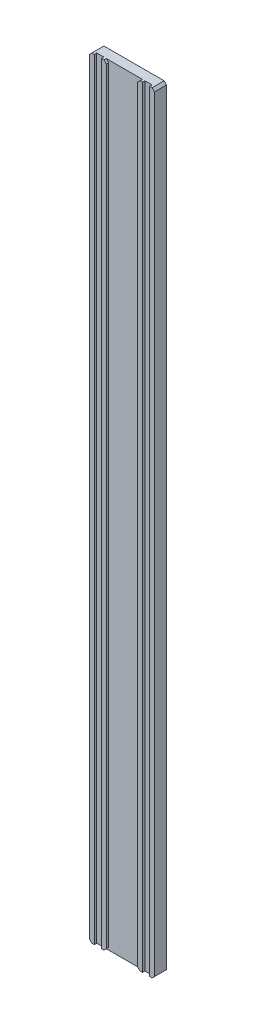
ISO-10303-21;
HEADER;
FILE_DESCRIPTION(('STEP AP214'),'2;1');
FILE_NAME('part.step','',(''),(''),'','','');
FILE_SCHEMA(('AUTOMOTIVE_DESIGN { 1 0 10303 214 1 1 1 1 }'));
ENDSEC;
DATA;
#1=APPLICATION_CONTEXT('core data for automotive mechanical design processes');
#2=APPLICATION_PROTOCOL_DEFINITION('international standard','automotive_design',2000,#1);
#3=PRODUCT_CONTEXT('',#1,'mechanical');
#4=PRODUCT('Part','Part','',(#3));
#5=PRODUCT_RELATED_PRODUCT_CATEGORY('part','',(#4));
#6=PRODUCT_DEFINITION_FORMATION('','',#4);
#7=PRODUCT_DEFINITION_CONTEXT('part definition',#1,'design');
#8=PRODUCT_DEFINITION('design','',#6,#7);
#9=PRODUCT_DEFINITION_SHAPE('','',#8);
#10=(LENGTH_UNIT() NAMED_UNIT(*) SI_UNIT(.MILLI.,.METRE.));
#11=(NAMED_UNIT(*) PLANE_ANGLE_UNIT() SI_UNIT($,.RADIAN.));
#12=(NAMED_UNIT(*) SI_UNIT($,.STERADIAN.) SOLID_ANGLE_UNIT());
#13=UNCERTAINTY_MEASURE_WITH_UNIT(LENGTH_MEASURE(1.E-05),#10,'distance_accuracy_value','');
#14=(GEOMETRIC_REPRESENTATION_CONTEXT(3) GLOBAL_UNCERTAINTY_ASSIGNED_CONTEXT((#13)) GLOBAL_UNIT_ASSIGNED_CONTEXT((#10,
#11,#12)) REPRESENTATION_CONTEXT('',''));
#15=CARTESIAN_POINT('',(0.,0.,0.));
#16=DIRECTION('',(0.,0.,1.));
#17=DIRECTION('',(1.,0.,0.));
#18=AXIS2_PLACEMENT_3D('',#15,#16,#17);
#19=CARTESIAN_POINT('',(-6.49999999999993,-119.,0.));
#20=DIRECTION('',(0.707106781186547,-0.707106781186547,0.));
#21=DIRECTION('',(0.,0.,1.));
#22=AXIS2_PLACEMENT_3D('',#19,#20,#21);
#23=PLANE('',#22);
#24=DIRECTION('',(0.,0.,1.));
#25=VECTOR('',#24,1.);
#26=CARTESIAN_POINT('',(-7.49999999999984,-120.,2.99999999999996));
#27=LINE('',#26,#25);
#28=CARTESIAN_POINT('',(-7.49999999999984,-120.,2.));
#29=VERTEX_POINT('',#28);
#30=CARTESIAN_POINT('',(-7.49999999999984,-120.,2.99999999999996));
#31=VERTEX_POINT('',#30);
#32=EDGE_CURVE('E363',#29,#31,#27,.T.);
#33=ORIENTED_EDGE('',*,*,#32,.F.);
#34=DIRECTION('',(0.707106781186529,0.707106781186567,0.));
#35=VECTOR('',#34,1.);
#36=CARTESIAN_POINT('',(-7.49999999999984,-120.,2.));
#37=LINE('',#36,#35);
#38=CARTESIAN_POINT('',(-6.49999999999993,-119.,2.));
#39=VERTEX_POINT('',#38);
#40=EDGE_CURVE('E242',#29,#39,#37,.T.);
#41=ORIENTED_EDGE('',*,*,#40,.T.);
#42=DIRECTION('',(0.,0.,-1.));
#43=VECTOR('',#42,1.);
#44=CARTESIAN_POINT('',(-6.49999999999993,-119.,0.));
#45=LINE('',#44,#43);
#46=CARTESIAN_POINT('',(-6.49999999999993,-119.,2.99999999999996));
#47=VERTEX_POINT('',#46);
#48=EDGE_CURVE('E358',#47,#39,#45,.T.);
#49=ORIENTED_EDGE('',*,*,#48,.F.);
#50=DIRECTION('',(0.707106781186548,0.707106781186548,0.));
#51=VECTOR('',#50,1.);
#52=CARTESIAN_POINT('',(149.5,36.9999999999998,2.99999999999998));
#53=LINE('',#52,#51);
#54=EDGE_CURVE('E372',#31,#47,#53,.T.);
#55=ORIENTED_EDGE('',*,*,#54,.F.);
#56=EDGE_LOOP('',(#33,#41,#49,#55));
#57=FACE_BOUND('',#56,.T.);
#58=ADVANCED_FACE('F36',(#57),#23,.T.);
#59=CARTESIAN_POINT('',(7.50000000000017,-120.,2.99999999999996));
#60=DIRECTION('',(0.707106781186538,0.707106781186557,0.));
#61=DIRECTION('',(0.,0.,-1.));
#62=AXIS2_PLACEMENT_3D('',#59,#60,#61);
#63=PLANE('',#62);
#64=DIRECTION('',(0.,0.,1.));
#65=VECTOR('',#64,1.);
#66=CARTESIAN_POINT('',(6.50000000000012,-119.,0.));
#67=LINE('',#66,#65);
#68=CARTESIAN_POINT('',(6.50000000000012,-119.,2.));
#69=VERTEX_POINT('',#68);
#70=CARTESIAN_POINT('',(6.50000000000012,-119.,2.99999999999996));
#71=VERTEX_POINT('',#70);
#72=EDGE_CURVE('E341',#69,#71,#67,.T.);
#73=ORIENTED_EDGE('',*,*,#72,.F.);
#74=DIRECTION('',(0.707106781186559,-0.707106781186536,0.));
#75=VECTOR('',#74,1.);
#76=CARTESIAN_POINT('',(6.50000000000012,-119.,2.));
#77=LINE('',#76,#75);
#78=CARTESIAN_POINT('',(7.50000000000018,-120.,2.));
#79=VERTEX_POINT('',#78);
#80=EDGE_CURVE('E244',#69,#79,#77,.T.);
#81=ORIENTED_EDGE('',*,*,#80,.T.);
#82=DIRECTION('',(0.,0.,-1.));
#83=VECTOR('',#82,1.);
#84=CARTESIAN_POINT('',(7.50000000000018,-120.,2.99999999999996));
#85=LINE('',#84,#83);
#86=CARTESIAN_POINT('',(7.50000000000018,-120.,2.99999999999996));
#87=VERTEX_POINT('',#86);
#88=EDGE_CURVE('E336',#87,#79,#85,.T.);
#89=ORIENTED_EDGE('',*,*,#88,.F.);
#90=DIRECTION('',(-0.707106781186557,0.707106781186538,0.));
#91=VECTOR('',#90,1.);
#92=CARTESIAN_POINT('',(7.50000000000017,-120.,2.99999999999996));
#93=LINE('',#92,#91);
#94=EDGE_CURVE('E349',#71,#87,#93,.F.);
#95=ORIENTED_EDGE('',*,*,#94,.F.);
#96=EDGE_LOOP('',(#73,#81,#89,#95));
#97=FACE_BOUND('',#96,.T.);
#98=ADVANCED_FACE('F433',(#97),#63,.F.);
#99=CARTESIAN_POINT('',(-6.50000000000018,199.,0.));
#100=DIRECTION('',(0.707106781186547,0.707106781186547,0.));
#101=DIRECTION('',(0.,0.,-1.));
#102=AXIS2_PLACEMENT_3D('',#99,#100,#101);
#103=PLANE('',#102);
#104=DIRECTION('',(0.,0.,1.));
#105=VECTOR('',#104,1.);
#106=CARTESIAN_POINT('',(-6.50000000000018,199.,3.));
#107=LINE('',#106,#105);
#108=CARTESIAN_POINT('',(-6.50000000000007,199.,2.));
#109=VERTEX_POINT('',#108);
#110=CARTESIAN_POINT('',(-6.50000000000018,199.,3.));
#111=VERTEX_POINT('',#110);
#112=EDGE_CURVE('E356',#109,#111,#107,.T.);
#113=ORIENTED_EDGE('',*,*,#112,.F.);
#114=DIRECTION('',(-0.707106781186549,0.707106781186546,0.));
#115=VECTOR('',#114,1.);
#116=CARTESIAN_POINT('',(-6.50000000000018,199.,2.));
#117=LINE('',#116,#115);
#118=CARTESIAN_POINT('',(-7.50000000000013,200.,2.));
#119=VERTEX_POINT('',#118);
#120=EDGE_CURVE('E247',#109,#119,#117,.T.);
#121=ORIENTED_EDGE('',*,*,#120,.T.);
#122=DIRECTION('',(0.,0.,-1.));
#123=VECTOR('',#122,1.);
#124=CARTESIAN_POINT('',(-7.50000000000013,200.,0.));
#125=LINE('',#124,#123);
#126=CARTESIAN_POINT('',(-7.50000000000013,200.,3.));
#127=VERTEX_POINT('',#126);
#128=EDGE_CURVE('E11',#127,#119,#125,.T.);
#129=ORIENTED_EDGE('',*,*,#128,.F.);
#130=DIRECTION('',(-0.707106781186548,0.707106781186548,0.));
#131=VECTOR('',#130,1.);
#132=CARTESIAN_POINT('',(-10.5000000000002,203.,3.));
#133=LINE('',#132,#131);
#134=EDGE_CURVE('E367',#111,#127,#133,.T.);
#135=ORIENTED_EDGE('',*,*,#134,.F.);
#136=EDGE_LOOP('',(#113,#121,#129,#135));
#137=FACE_BOUND('',#136,.T.);
#138=ADVANCED_FACE('F412',(#137),#103,.T.);
#139=CARTESIAN_POINT('',(-13.5000000000002,200.,3.));
#140=DIRECTION('',(0.,0.,1.));
#141=DIRECTION('',(0.,-1.,0.));
#142=AXIS2_PLACEMENT_3D('',#139,#140,#141);
#143=PLANE('',#142);
#144=DIRECTION('',(1.,0.,0.));
#145=VECTOR('',#144,1.);
#146=CARTESIAN_POINT('',(-13.5000000000002,200.,3.));
#147=LINE('',#146,#145);
#148=CARTESIAN_POINT('',(-8.50000000000018,200.,2.99999999999961));
#149=VERTEX_POINT('',#148);
#150=EDGE_CURVE('E282',#149,#127,#147,.T.);
#151=ORIENTED_EDGE('',*,*,#150,.F.);
#152=DIRECTION('',(0.,-1.,0.));
#153=VECTOR('',#152,1.);
#154=CARTESIAN_POINT('',(-8.50000000000018,200.,2.99999999999961));
#155=LINE('',#154,#153);
#156=CARTESIAN_POINT('',(-8.49999999999993,-120.,2.99999999999998));
#157=VERTEX_POINT('',#156);
#158=EDGE_CURVE('E270',#149,#157,#155,.T.);
#159=ORIENTED_EDGE('',*,*,#158,.T.);
#160=DIRECTION('',(1.,0.,0.));
#161=VECTOR('',#160,1.);
#162=CARTESIAN_POINT('',(-13.4999999999999,-120.,2.99999999999996));
#163=LINE('',#162,#161);
#164=EDGE_CURVE('E288',#157,#31,#163,.T.);
#165=ORIENTED_EDGE('',*,*,#164,.T.);
#166=ORIENTED_EDGE('',*,*,#54,.T.);
#167=DIRECTION('',(0.,-1.,0.));
#168=VECTOR('',#167,1.);
#169=CARTESIAN_POINT('',(-6.50000000000018,200.,3.));
#170=LINE('',#169,#168);
#171=EDGE_CURVE('E273',#111,#47,#170,.T.);
#172=ORIENTED_EDGE('',*,*,#171,.F.);
#173=ORIENTED_EDGE('',*,*,#134,.T.);
#174=EDGE_LOOP('',(#151,#159,#165,#166,#172,#173));
#175=FACE_BOUND('',#174,.T.);
#176=ADVANCED_FACE('F405',(#175),#143,.T.);
#177=CARTESIAN_POINT('',(-12.5,-120.,2.99999999999996));
#178=VERTEX_POINT('',#177);
#179=CARTESIAN_POINT('',(-11.4999999999999,-120.,2.99999999999998));
#180=VERTEX_POINT('',#179);
#181=EDGE_CURVE('E289',#178,#180,#163,.T.);
#182=ORIENTED_EDGE('',*,*,#181,.T.);
#183=DIRECTION('',(0.,-1.,0.));
#184=VECTOR('',#183,1.);
#185=CARTESIAN_POINT('',(-11.5000000000002,200.,2.99999999999961));
#186=LINE('',#185,#184);
#187=CARTESIAN_POINT('',(-11.5000000000002,200.,2.99999999999961));
#188=VERTEX_POINT('',#187);
#189=EDGE_CURVE('E262',#188,#180,#186,.T.);
#190=ORIENTED_EDGE('',*,*,#189,.F.);
#191=CARTESIAN_POINT('',(-12.5000000000002,200.,3.));
#192=VERTEX_POINT('',#191);
#193=EDGE_CURVE('E285',#192,#188,#147,.T.);
#194=ORIENTED_EDGE('',*,*,#193,.F.);
#195=DIRECTION('',(0.707106781186557,0.707106781186538,0.));
#196=VECTOR('',#195,1.);
#197=CARTESIAN_POINT('',(-13.0000000000002,199.5,3.));
#198=LINE('',#197,#196);
#199=CARTESIAN_POINT('',(-13.5000000000002,199.,3.));
#200=VERTEX_POINT('',#199);
#201=EDGE_CURVE('E365',#192,#200,#198,.F.);
#202=ORIENTED_EDGE('',*,*,#201,.T.);
#203=DIRECTION('',(0.,-1.,0.));
#204=VECTOR('',#203,1.);
#205=CARTESIAN_POINT('',(-13.5000000000002,200.,3.));
#206=LINE('',#205,#204);
#207=CARTESIAN_POINT('',(-13.4999999999999,-119.,2.99999999999996));
#208=VERTEX_POINT('',#207);
#209=EDGE_CURVE('E279',#200,#208,#206,.T.);
#210=ORIENTED_EDGE('',*,*,#209,.T.);
#211=DIRECTION('',(-0.707106781186548,0.707106781186548,0.));
#212=VECTOR('',#211,1.);
#213=CARTESIAN_POINT('',(-173.,40.5000000000001,2.99999999999998));
#214=LINE('',#213,#212);
#215=EDGE_CURVE('E370',#208,#178,#214,.F.);
#216=ORIENTED_EDGE('',*,*,#215,.T.);
#217=EDGE_LOOP('',(#182,#190,#194,#202,#210,#216));
#218=FACE_BOUND('',#217,.T.);
#219=ADVANCED_FACE('F387',(#218),#143,.T.);
#220=CARTESIAN_POINT('',(13.4999999999999,200.,3.));
#221=DIRECTION('',(0.,0.,-1.));
#222=DIRECTION('',(0.,1.,0.));
#223=AXIS2_PLACEMENT_3D('',#220,#221,#222);
#224=PLANE('',#223);
#225=DIRECTION('',(-1.,0.,0.));
#226=VECTOR('',#225,1.);
#227=CARTESIAN_POINT('',(13.4999999999999,200.,3.));
#228=LINE('',#227,#226);
#229=CARTESIAN_POINT('',(12.4999999999999,200.,3.));
#230=VERTEX_POINT('',#229);
#231=CARTESIAN_POINT('',(11.4999999999999,200.,2.99999999999961));
#232=VERTEX_POINT('',#231);
#233=EDGE_CURVE('E329',#230,#232,#228,.T.);
#234=ORIENTED_EDGE('',*,*,#233,.T.);
#235=DIRECTION('',(0.,-1.,0.));
#236=VECTOR('',#235,1.);
#237=CARTESIAN_POINT('',(11.4999999999999,200.,2.99999999999961));
#238=LINE('',#237,#236);
#239=CARTESIAN_POINT('',(11.5000000000001,-120.,2.99999999999998));
#240=VERTEX_POINT('',#239);
#241=EDGE_CURVE('E312',#232,#240,#238,.T.);
#242=ORIENTED_EDGE('',*,*,#241,.T.);
#243=DIRECTION('',(-1.,0.,0.));
#244=VECTOR('',#243,1.);
#245=CARTESIAN_POINT('',(13.5000000000001,-120.,2.99999999999996));
#246=LINE('',#245,#244);
#247=CARTESIAN_POINT('',(12.5000000000001,-120.,2.99999999999996));
#248=VERTEX_POINT('',#247);
#249=EDGE_CURVE('E325',#248,#240,#246,.T.);
#250=ORIENTED_EDGE('',*,*,#249,.F.);
#251=DIRECTION('',(0.707106781186548,0.707106781186548,0.));
#252=VECTOR('',#251,1.);
#253=CARTESIAN_POINT('',(13.5000000000001,-119.,2.99999999999996));
#254=LINE('',#253,#252);
#255=CARTESIAN_POINT('',(13.5000000000001,-119.,2.99999999999996));
#256=VERTEX_POINT('',#255);
#257=EDGE_CURVE('E347',#248,#256,#254,.T.);
#258=ORIENTED_EDGE('',*,*,#257,.T.);
#259=DIRECTION('',(0.,-1.,0.));
#260=VECTOR('',#259,1.);
#261=CARTESIAN_POINT('',(13.4999999999999,200.,3.));
#262=LINE('',#261,#260);
#263=CARTESIAN_POINT('',(13.4999999999999,199.,3.));
#264=VERTEX_POINT('',#263);
#265=EDGE_CURVE('E207',#264,#256,#262,.T.);
#266=ORIENTED_EDGE('',*,*,#265,.F.);
#267=DIRECTION('',(-0.707106781186548,0.707106781186548,0.));
#268=VECTOR('',#267,1.);
#269=CARTESIAN_POINT('',(13.4999999999999,199.,3.));
#270=LINE('',#269,#268);
#271=EDGE_CURVE('E343',#264,#230,#270,.T.);
#272=ORIENTED_EDGE('',*,*,#271,.T.);
#273=EDGE_LOOP('',(#234,#242,#250,#258,#266,#272));
#274=FACE_BOUND('',#273,.T.);
#275=ADVANCED_FACE('F449',(#274),#224,.F.);
#276=CARTESIAN_POINT('',(0.,0.,2.));
#277=DIRECTION('',(0.,0.,-1.));
#278=DIRECTION('',(-1.,0.,0.));
#279=AXIS2_PLACEMENT_3D('',#276,#277,#278);
#280=PLANE('',#279);
#281=DIRECTION('',(0.,1.,0.));
#282=VECTOR('',#281,1.);
#283=CARTESIAN_POINT('',(-6.50000000000011,80.,2.));
#284=LINE('',#283,#282);
#285=EDGE_CURVE('E292',#39,#109,#284,.T.);
#286=ORIENTED_EDGE('',*,*,#285,.F.);
#287=ORIENTED_EDGE('',*,*,#40,.F.);
#288=DIRECTION('',(-1.,0.,0.));
#289=VECTOR('',#288,1.);
#290=CARTESIAN_POINT('',(-6.5,-120.,2.));
#291=LINE('',#290,#289);
#292=EDGE_CURVE('E52',#79,#29,#291,.T.);
#293=ORIENTED_EDGE('',*,*,#292,.F.);
#294=ORIENTED_EDGE('',*,*,#80,.F.);
#295=DIRECTION('',(0.,1.,0.));
#296=VECTOR('',#295,1.);
#297=CARTESIAN_POINT('',(6.49999999999998,80.,2.));
#298=LINE('',#297,#296);
#299=CARTESIAN_POINT('',(6.49999999999987,199.,2.));
#300=VERTEX_POINT('',#299);
#301=EDGE_CURVE('E332',#69,#300,#298,.T.);
#302=ORIENTED_EDGE('',*,*,#301,.T.);
#303=DIRECTION('',(-0.707106781186546,-0.707106781186549,0.));
#304=VECTOR('',#303,1.);
#305=CARTESIAN_POINT('',(6.49999999999987,199.,2.));
#306=LINE('',#305,#304);
#307=CARTESIAN_POINT('',(7.49999999999986,200.,2.));
#308=VERTEX_POINT('',#307);
#309=EDGE_CURVE('E249',#308,#300,#306,.T.);
#310=ORIENTED_EDGE('',*,*,#309,.F.);
#311=DIRECTION('',(-1.,0.,0.));
#312=VECTOR('',#311,1.);
#313=CARTESIAN_POINT('',(-6.50000000000007,200.,2.));
#314=LINE('',#313,#312);
#315=EDGE_CURVE('E60',#308,#119,#314,.T.);
#316=ORIENTED_EDGE('',*,*,#315,.T.);
#317=ORIENTED_EDGE('',*,*,#120,.F.);
#318=EDGE_LOOP('',(#286,#287,#293,#294,#302,#310,#316,#317));
#319=FACE_BOUND('',#318,.T.);
#320=ADVANCED_FACE('F417',(#319),#280,.F.);
#321=CARTESIAN_POINT('',(13.4999999999999,200.,0.));
#322=DIRECTION('',(0.,-1.,0.));
#323=DIRECTION('',(1.,0.,0.));
#324=AXIS2_PLACEMENT_3D('',#321,#322,#323);
#325=PLANE('',#324);
#326=DIRECTION('',(1.,0.,0.));
#327=VECTOR('',#326,1.);
#328=CARTESIAN_POINT('',(8.49999999999987,200.,1.99999999999961));
#329=LINE('',#328,#327);
#330=CARTESIAN_POINT('',(8.49999999999987,200.,1.99999999999961));
#331=VERTEX_POINT('',#330);
#332=CARTESIAN_POINT('',(11.4999999999999,200.,1.99999999999961));
#333=VERTEX_POINT('',#332);
#334=EDGE_CURVE('E298',#331,#333,#329,.T.);
#335=ORIENTED_EDGE('',*,*,#334,.T.);
#336=DIRECTION('',(0.,0.,1.));
#337=VECTOR('',#336,1.);
#338=CARTESIAN_POINT('',(11.4999999999999,200.,1.99999999999961));
#339=LINE('',#338,#337);
#340=EDGE_CURVE('E302',#333,#232,#339,.T.);
#341=ORIENTED_EDGE('',*,*,#340,.T.);
#342=ORIENTED_EDGE('',*,*,#233,.F.);
#343=DIRECTION('',(0.,0.,-1.));
#344=VECTOR('',#343,1.);
#345=CARTESIAN_POINT('',(12.4999999999999,200.,0.));
#346=LINE('',#345,#344);
#347=CARTESIAN_POINT('',(12.4999999999999,200.,-2.));
#348=VERTEX_POINT('',#347);
#349=EDGE_CURVE('E210',#230,#348,#346,.T.);
#350=ORIENTED_EDGE('',*,*,#349,.T.);
#351=DIRECTION('',(1.,0.,0.));
#352=VECTOR('',#351,1.);
#353=CARTESIAN_POINT('',(-12.5000000000002,200.,-2.));
#354=LINE('',#353,#352);
#355=CARTESIAN_POINT('',(-12.5000000000002,200.,-2.));
#356=VERTEX_POINT('',#355);
#357=EDGE_CURVE('E239',#356,#348,#354,.T.);
#358=ORIENTED_EDGE('',*,*,#357,.F.);
#359=DIRECTION('',(0.,0.,1.));
#360=VECTOR('',#359,1.);
#361=CARTESIAN_POINT('',(-12.5000000000002,200.,0.));
#362=LINE('',#361,#360);
#363=EDGE_CURVE('E45',#356,#192,#362,.T.);
#364=ORIENTED_EDGE('',*,*,#363,.T.);
#365=ORIENTED_EDGE('',*,*,#193,.T.);
#366=DIRECTION('',(0.,0.,1.));
#367=VECTOR('',#366,1.);
#368=CARTESIAN_POINT('',(-11.5000000000002,200.,1.99999999999961));
#369=LINE('',#368,#367);
#370=CARTESIAN_POINT('',(-11.5000000000002,200.,1.99999999999961));
#371=VERTEX_POINT('',#370);
#372=EDGE_CURVE('E254',#371,#188,#369,.T.);
#373=ORIENTED_EDGE('',*,*,#372,.F.);
#374=DIRECTION('',(-1.,0.,0.));
#375=VECTOR('',#374,1.);
#376=CARTESIAN_POINT('',(-8.50000000000018,200.,1.99999999999961));
#377=LINE('',#376,#375);
#378=CARTESIAN_POINT('',(-8.50000000000018,200.,1.99999999999961));
#379=VERTEX_POINT('',#378);
#380=EDGE_CURVE('E256',#379,#371,#377,.T.);
#381=ORIENTED_EDGE('',*,*,#380,.F.);
#382=DIRECTION('',(0.,0.,-1.));
#383=VECTOR('',#382,1.);
#384=CARTESIAN_POINT('',(-8.50000000000018,200.,2.99999999999961));
#385=LINE('',#384,#383);
#386=EDGE_CURVE('E260',#149,#379,#385,.T.);
#387=ORIENTED_EDGE('',*,*,#386,.F.);
#388=ORIENTED_EDGE('',*,*,#150,.T.);
#389=ORIENTED_EDGE('',*,*,#128,.T.);
#390=ORIENTED_EDGE('',*,*,#315,.F.);
#391=DIRECTION('',(0.,0.,1.));
#392=VECTOR('',#391,1.);
#393=CARTESIAN_POINT('',(7.49999999999986,200.,0.));
#394=LINE('',#393,#392);
#395=CARTESIAN_POINT('',(7.49999999999986,200.,3.));
#396=VERTEX_POINT('',#395);
#397=EDGE_CURVE('E354',#308,#396,#394,.T.);
#398=ORIENTED_EDGE('',*,*,#397,.T.);
#399=CARTESIAN_POINT('',(8.49999999999987,200.,2.99999999999961));
#400=VERTEX_POINT('',#399);
#401=EDGE_CURVE('E328',#400,#396,#228,.T.);
#402=ORIENTED_EDGE('',*,*,#401,.F.);
#403=DIRECTION('',(0.,0.,-1.));
#404=VECTOR('',#403,1.);
#405=CARTESIAN_POINT('',(8.49999999999987,200.,2.99999999999961));
#406=LINE('',#405,#404);
#407=EDGE_CURVE('E295',#400,#331,#406,.T.);
#408=ORIENTED_EDGE('',*,*,#407,.T.);
#409=EDGE_LOOP('',(#335,#341,#342,#350,#358,#364,#365,#373,#381,#387,#388,#389,#390,#398,#402,#408));
#410=FACE_BOUND('',#409,.T.);
#411=ADVANCED_FACE('F381',(#410),#325,.F.);
#412=CARTESIAN_POINT('',(8.50000000000012,-120.,2.99999999999996));
#413=VERTEX_POINT('',#412);
#414=EDGE_CURVE('E322',#413,#87,#246,.T.);
#415=ORIENTED_EDGE('',*,*,#414,.F.);
#416=DIRECTION('',(0.,-1.,0.));
#417=VECTOR('',#416,1.);
#418=CARTESIAN_POINT('',(8.49999999999987,200.,2.99999999999961));
#419=LINE('',#418,#417);
#420=EDGE_CURVE('E305',#400,#413,#419,.T.);
#421=ORIENTED_EDGE('',*,*,#420,.F.);
#422=ORIENTED_EDGE('',*,*,#401,.T.);
#423=DIRECTION('',(0.707106781186548,0.707106781186548,0.));
#424=VECTOR('',#423,1.);
#425=CARTESIAN_POINT('',(7.49999999999987,200.,3.));
#426=LINE('',#425,#424);
#427=CARTESIAN_POINT('',(6.49999999999987,199.,3.));
#428=VERTEX_POINT('',#427);
#429=EDGE_CURVE('E345',#396,#428,#426,.F.);
#430=ORIENTED_EDGE('',*,*,#429,.T.);
#431=DIRECTION('',(0.,-1.,0.));
#432=VECTOR('',#431,1.);
#433=CARTESIAN_POINT('',(6.49999999999987,200.,3.));
#434=LINE('',#433,#432);
#435=EDGE_CURVE('E315',#428,#71,#434,.T.);
#436=ORIENTED_EDGE('',*,*,#435,.T.);
#437=ORIENTED_EDGE('',*,*,#94,.T.);
#438=EDGE_LOOP('',(#415,#421,#422,#430,#436,#437));
#439=FACE_BOUND('',#438,.T.);
#440=ADVANCED_FACE('F426',(#439),#224,.F.);
#441=CARTESIAN_POINT('',(13.5000000000001,-120.,2.99999999999996));
#442=DIRECTION('',(0.,1.,0.));
#443=DIRECTION('',(-1.,0.,0.));
#444=AXIS2_PLACEMENT_3D('',#441,#442,#443);
#445=PLANE('',#444);
#446=ORIENTED_EDGE('',*,*,#249,.T.);
#447=DIRECTION('',(0.,0.,1.));
#448=VECTOR('',#447,1.);
#449=CARTESIAN_POINT('',(11.5000000000001,-120.,1.99999999999998));
#450=LINE('',#449,#448);
#451=CARTESIAN_POINT('',(11.5000000000001,-120.,1.99999999999998));
#452=VERTEX_POINT('',#451);
#453=EDGE_CURVE('E299',#452,#240,#450,.T.);
#454=ORIENTED_EDGE('',*,*,#453,.F.);
#455=DIRECTION('',(1.,0.,0.));
#456=VECTOR('',#455,1.);
#457=CARTESIAN_POINT('',(8.50000000000012,-120.,1.99999999999998));
#458=LINE('',#457,#456);
#459=CARTESIAN_POINT('',(8.50000000000012,-120.,1.99999999999998));
#460=VERTEX_POINT('',#459);
#461=EDGE_CURVE('E308',#460,#452,#458,.T.);
#462=ORIENTED_EDGE('',*,*,#461,.F.);
#463=DIRECTION('',(0.,0.,-1.));
#464=VECTOR('',#463,1.);
#465=CARTESIAN_POINT('',(8.50000000000012,-120.,2.99999999999998));
#466=LINE('',#465,#464);
#467=EDGE_CURVE('E294',#413,#460,#466,.T.);
#468=ORIENTED_EDGE('',*,*,#467,.F.);
#469=ORIENTED_EDGE('',*,*,#414,.T.);
#470=ORIENTED_EDGE('',*,*,#88,.T.);
#471=ORIENTED_EDGE('',*,*,#292,.T.);
#472=ORIENTED_EDGE('',*,*,#32,.T.);
#473=ORIENTED_EDGE('',*,*,#164,.F.);
#474=DIRECTION('',(0.,0.,-1.));
#475=VECTOR('',#474,1.);
#476=CARTESIAN_POINT('',(-8.49999999999993,-120.,2.99999999999998));
#477=LINE('',#476,#475);
#478=CARTESIAN_POINT('',(-8.49999999999993,-120.,1.99999999999998));
#479=VERTEX_POINT('',#478);
#480=EDGE_CURVE('E257',#157,#479,#477,.T.);
#481=ORIENTED_EDGE('',*,*,#480,.T.);
#482=DIRECTION('',(-1.,0.,0.));
#483=VECTOR('',#482,1.);
#484=CARTESIAN_POINT('',(-8.49999999999993,-120.,1.99999999999998));
#485=LINE('',#484,#483);
#486=CARTESIAN_POINT('',(-11.4999999999999,-120.,1.99999999999998));
#487=VERTEX_POINT('',#486);
#488=EDGE_CURVE('E265',#479,#487,#485,.T.);
#489=ORIENTED_EDGE('',*,*,#488,.T.);
#490=DIRECTION('',(0.,0.,1.));
#491=VECTOR('',#490,1.);
#492=CARTESIAN_POINT('',(-11.4999999999999,-120.,1.99999999999998));
#493=LINE('',#492,#491);
#494=EDGE_CURVE('E253',#487,#180,#493,.T.);
#495=ORIENTED_EDGE('',*,*,#494,.T.);
#496=ORIENTED_EDGE('',*,*,#181,.F.);
#497=DIRECTION('',(0.,0.,-1.));
#498=VECTOR('',#497,1.);
#499=CARTESIAN_POINT('',(-12.5,-120.,2.99999999999996));
#500=LINE('',#499,#498);
#501=CARTESIAN_POINT('',(-12.5,-120.,-2.));
#502=VERTEX_POINT('',#501);
#503=EDGE_CURVE('E361',#178,#502,#500,.T.);
#504=ORIENTED_EDGE('',*,*,#503,.T.);
#505=DIRECTION('',(-1.,0.,0.));
#506=VECTOR('',#505,1.);
#507=CARTESIAN_POINT('',(12.5000000000001,-120.,-2.));
#508=LINE('',#507,#506);
#509=CARTESIAN_POINT('',(12.5000000000001,-120.,-2.));
#510=VERTEX_POINT('',#509);
#511=EDGE_CURVE('E220',#510,#502,#508,.T.);
#512=ORIENTED_EDGE('',*,*,#511,.F.);
#513=DIRECTION('',(0.,0.,1.));
#514=VECTOR('',#513,1.);
#515=CARTESIAN_POINT('',(12.5000000000001,-120.,2.99999999999996));
#516=LINE('',#515,#514);
#517=EDGE_CURVE('E216',#510,#248,#516,.T.);
#518=ORIENTED_EDGE('',*,*,#517,.T.);
#519=EDGE_LOOP('',(#446,#454,#462,#468,#469,#470,#471,#472,#473,#481,#489,#495,#496,#504,#512,#518));
#520=FACE_BOUND('',#519,.T.);
#521=ADVANCED_FACE('F393',(#520),#445,.F.);
#522=CARTESIAN_POINT('',(13.5,0.,0.));
#523=DIRECTION('',(1.,0.,0.));
#524=DIRECTION('',(0.,1.,0.));
#525=AXIS2_PLACEMENT_3D('',#522,#523,#524);
#526=PLANE('',#525);
#527=ORIENTED_EDGE('',*,*,#265,.T.);
#528=DIRECTION('',(0.,0.,-1.));
#529=VECTOR('',#528,1.);
#530=CARTESIAN_POINT('',(13.5000000000001,-119.,0.));
#531=LINE('',#530,#529);
#532=CARTESIAN_POINT('',(13.5000000000001,-119.,-2.));
#533=VERTEX_POINT('',#532);
#534=EDGE_CURVE('E200',#256,#533,#531,.T.);
#535=ORIENTED_EDGE('',*,*,#534,.T.);
#536=DIRECTION('',(0.,-1.,0.));
#537=VECTOR('',#536,1.);
#538=CARTESIAN_POINT('',(13.4999999999999,199.,-2.));
#539=LINE('',#538,#537);
#540=CARTESIAN_POINT('',(13.4999999999999,199.,-2.));
#541=VERTEX_POINT('',#540);
#542=EDGE_CURVE('E205',#541,#533,#539,.T.);
#543=ORIENTED_EDGE('',*,*,#542,.F.);
#544=DIRECTION('',(0.,0.,1.));
#545=VECTOR('',#544,1.);
#546=CARTESIAN_POINT('',(13.4999999999999,199.,3.));
#547=LINE('',#546,#545);
#548=EDGE_CURVE('E211',#541,#264,#547,.T.);
#549=ORIENTED_EDGE('',*,*,#548,.T.);
#550=EDGE_LOOP('',(#527,#535,#543,#549));
#551=FACE_BOUND('',#550,.T.);
#552=ADVANCED_FACE('F202',(#551),#526,.T.);
#553=CARTESIAN_POINT('',(6.50000000000002,0.,0.));
#554=DIRECTION('',(1.,0.,0.));
#555=DIRECTION('',(0.,1.,0.));
#556=AXIS2_PLACEMENT_3D('',#553,#554,#555);
#557=PLANE('',#556);
#558=DIRECTION('',(0.,0.,-1.));
#559=VECTOR('',#558,1.);
#560=CARTESIAN_POINT('',(6.49999999999987,199.,0.));
#561=LINE('',#560,#559);
#562=EDGE_CURVE('E338',#428,#300,#561,.T.);
#563=ORIENTED_EDGE('',*,*,#562,.T.);
#564=ORIENTED_EDGE('',*,*,#301,.F.);
#565=ORIENTED_EDGE('',*,*,#72,.T.);
#566=ORIENTED_EDGE('',*,*,#435,.F.);
#567=EDGE_LOOP('',(#563,#564,#565,#566));
#568=FACE_BOUND('',#567,.T.);
#569=ADVANCED_FACE('F430',(#568),#557,.F.);
#570=CARTESIAN_POINT('',(13.5000000000001,-119.,0.));
#571=DIRECTION('',(0.707106781186547,-0.707106781186547,0.));
#572=DIRECTION('',(0.,0.,1.));
#573=AXIS2_PLACEMENT_3D('',#570,#571,#572);
#574=PLANE('',#573);
#575=ORIENTED_EDGE('',*,*,#257,.F.);
#576=ORIENTED_EDGE('',*,*,#517,.F.);
#577=DIRECTION('',(-0.707106781186547,-0.707106781186547,0.));
#578=VECTOR('',#577,1.);
#579=CARTESIAN_POINT('',(13.5000000000001,-119.,-2.));
#580=LINE('',#579,#578);
#581=EDGE_CURVE('E214',#533,#510,#580,.T.);
#582=ORIENTED_EDGE('',*,*,#581,.F.);
#583=ORIENTED_EDGE('',*,*,#534,.F.);
#584=EDGE_LOOP('',(#575,#576,#582,#583));
#585=FACE_BOUND('',#584,.T.);
#586=ADVANCED_FACE('F215',(#585),#574,.T.);
#587=CARTESIAN_POINT('',(7.49999999999987,200.,0.));
#588=DIRECTION('',(0.707106781186547,-0.707106781186547,0.));
#589=DIRECTION('',(0.,0.,1.));
#590=AXIS2_PLACEMENT_3D('',#587,#588,#589);
#591=PLANE('',#590);
#592=ORIENTED_EDGE('',*,*,#309,.T.);
#593=ORIENTED_EDGE('',*,*,#562,.F.);
#594=ORIENTED_EDGE('',*,*,#429,.F.);
#595=ORIENTED_EDGE('',*,*,#397,.F.);
#596=EDGE_LOOP('',(#592,#593,#594,#595));
#597=FACE_BOUND('',#596,.T.);
#598=ADVANCED_FACE('F422',(#597),#591,.F.);
#599=CARTESIAN_POINT('',(13.4999999999999,199.,0.));
#600=DIRECTION('',(0.707106781186547,0.707106781186547,0.));
#601=DIRECTION('',(0.,0.,-1.));
#602=AXIS2_PLACEMENT_3D('',#599,#600,#601);
#603=PLANE('',#602);
#604=ORIENTED_EDGE('',*,*,#548,.F.);
#605=DIRECTION('',(0.707106781186547,-0.707106781186547,0.));
#606=VECTOR('',#605,1.);
#607=CARTESIAN_POINT('',(12.4999999999999,200.,-2.));
#608=LINE('',#607,#606);
#609=EDGE_CURVE('E226',#348,#541,#608,.T.);
#610=ORIENTED_EDGE('',*,*,#609,.F.);
#611=ORIENTED_EDGE('',*,*,#349,.F.);
#612=ORIENTED_EDGE('',*,*,#271,.F.);
#613=EDGE_LOOP('',(#604,#610,#611,#612));
#614=FACE_BOUND('',#613,.T.);
#615=ADVANCED_FACE('F482',(#614),#603,.T.);
#616=CARTESIAN_POINT('',(11.4999999999999,200.,1.99999999999961));
#617=DIRECTION('',(1.,0.,0.));
#618=DIRECTION('',(0.,1.,0.));
#619=AXIS2_PLACEMENT_3D('',#616,#617,#618);
#620=PLANE('',#619);
#621=ORIENTED_EDGE('',*,*,#453,.T.);
#622=ORIENTED_EDGE('',*,*,#241,.F.);
#623=ORIENTED_EDGE('',*,*,#340,.F.);
#624=DIRECTION('',(0.,-1.,0.));
#625=VECTOR('',#624,1.);
#626=CARTESIAN_POINT('',(11.4999999999999,200.,1.99999999999961));
#627=LINE('',#626,#625);
#628=EDGE_CURVE('E316',#333,#452,#627,.T.);
#629=ORIENTED_EDGE('',*,*,#628,.T.);
#630=EDGE_LOOP('',(#621,#622,#623,#629));
#631=FACE_BOUND('',#630,.T.);
#632=ADVANCED_FACE('F446',(#631),#620,.F.);
#633=CARTESIAN_POINT('',(8.49999999999987,200.,1.99999999999961));
#634=DIRECTION('',(0.,0.,-1.));
#635=DIRECTION('',(0.,1.,0.));
#636=AXIS2_PLACEMENT_3D('',#633,#634,#635);
#637=PLANE('',#636);
#638=ORIENTED_EDGE('',*,*,#461,.T.);
#639=ORIENTED_EDGE('',*,*,#628,.F.);
#640=ORIENTED_EDGE('',*,*,#334,.F.);
#641=DIRECTION('',(0.,-1.,0.));
#642=VECTOR('',#641,1.);
#643=CARTESIAN_POINT('',(8.49999999999987,200.,1.99999999999961));
#644=LINE('',#643,#642);
#645=EDGE_CURVE('E318',#331,#460,#644,.T.);
#646=ORIENTED_EDGE('',*,*,#645,.T.);
#647=EDGE_LOOP('',(#638,#639,#640,#646));
#648=FACE_BOUND('',#647,.T.);
#649=ADVANCED_FACE('F444',(#648),#637,.F.);
#650=CARTESIAN_POINT('',(8.49999999999987,200.,2.99999999999961));
#651=DIRECTION('',(-1.,0.,0.));
#652=DIRECTION('',(0.,-1.,0.));
#653=AXIS2_PLACEMENT_3D('',#650,#651,#652);
#654=PLANE('',#653);
#655=ORIENTED_EDGE('',*,*,#467,.T.);
#656=ORIENTED_EDGE('',*,*,#645,.F.);
#657=ORIENTED_EDGE('',*,*,#407,.F.);
#658=ORIENTED_EDGE('',*,*,#420,.T.);
#659=EDGE_LOOP('',(#655,#656,#657,#658));
#660=FACE_BOUND('',#659,.T.);
#661=ADVANCED_FACE('F439',(#660),#654,.F.);
#662=CARTESIAN_POINT('',(-13.5,0.,0.));
#663=DIRECTION('',(-1.,0.,0.));
#664=DIRECTION('',(0.,1.,0.));
#665=AXIS2_PLACEMENT_3D('',#662,#663,#664);
#666=PLANE('',#665);
#667=DIRECTION('',(0.,0.,-1.));
#668=VECTOR('',#667,1.);
#669=CARTESIAN_POINT('',(-13.5000000000002,199.,0.));
#670=LINE('',#669,#668);
#671=CARTESIAN_POINT('',(-13.5000000000002,199.,-2.));
#672=VERTEX_POINT('',#671);
#673=EDGE_CURVE('E374',#200,#672,#670,.T.);
#674=ORIENTED_EDGE('',*,*,#673,.T.);
#675=DIRECTION('',(0.,1.,0.));
#676=VECTOR('',#675,1.);
#677=CARTESIAN_POINT('',(-13.4999999999999,-119.,-2.));
#678=LINE('',#677,#676);
#679=CARTESIAN_POINT('',(-13.4999999999999,-119.,-2.));
#680=VERTEX_POINT('',#679);
#681=EDGE_CURVE('E233',#680,#672,#678,.T.);
#682=ORIENTED_EDGE('',*,*,#681,.F.);
#683=DIRECTION('',(0.,0.,1.));
#684=VECTOR('',#683,1.);
#685=CARTESIAN_POINT('',(-13.4999999999999,-119.,0.));
#686=LINE('',#685,#684);
#687=EDGE_CURVE('E376',#680,#208,#686,.T.);
#688=ORIENTED_EDGE('',*,*,#687,.T.);
#689=ORIENTED_EDGE('',*,*,#209,.F.);
#690=EDGE_LOOP('',(#674,#682,#688,#689));
#691=FACE_BOUND('',#690,.T.);
#692=ADVANCED_FACE('F456',(#691),#666,.T.);
#693=CARTESIAN_POINT('',(-6.50000000000002,0.,0.));
#694=DIRECTION('',(-1.,0.,0.));
#695=DIRECTION('',(0.,1.,0.));
#696=AXIS2_PLACEMENT_3D('',#693,#694,#695);
#697=PLANE('',#696);
#698=ORIENTED_EDGE('',*,*,#48,.T.);
#699=ORIENTED_EDGE('',*,*,#285,.T.);
#700=ORIENTED_EDGE('',*,*,#112,.T.);
#701=ORIENTED_EDGE('',*,*,#171,.T.);
#702=EDGE_LOOP('',(#698,#699,#700,#701));
#703=FACE_BOUND('',#702,.T.);
#704=ADVANCED_FACE('F466',(#703),#697,.F.);
#705=CARTESIAN_POINT('',(-12.5,-120.,2.99999999999996));
#706=DIRECTION('',(0.707106781186547,0.707106781186547,0.));
#707=DIRECTION('',(0.,0.,-1.));
#708=AXIS2_PLACEMENT_3D('',#705,#706,#707);
#709=PLANE('',#708);
#710=ORIENTED_EDGE('',*,*,#215,.F.);
#711=ORIENTED_EDGE('',*,*,#687,.F.);
#712=DIRECTION('',(-0.707106781186547,0.707106781186547,0.));
#713=VECTOR('',#712,1.);
#714=CARTESIAN_POINT('',(-12.5,-120.,-2.));
#715=LINE('',#714,#713);
#716=EDGE_CURVE('E230',#502,#680,#715,.T.);
#717=ORIENTED_EDGE('',*,*,#716,.F.);
#718=ORIENTED_EDGE('',*,*,#503,.F.);
#719=EDGE_LOOP('',(#710,#711,#717,#718));
#720=FACE_BOUND('',#719,.T.);
#721=ADVANCED_FACE('F454',(#720),#709,.F.);
#722=CARTESIAN_POINT('',(-12.5000000000002,200.,0.));
#723=DIRECTION('',(0.707106781186538,-0.707106781186557,0.));
#724=DIRECTION('',(0.,0.,1.));
#725=AXIS2_PLACEMENT_3D('',#722,#723,#724);
#726=PLANE('',#725);
#727=ORIENTED_EDGE('',*,*,#363,.F.);
#728=DIRECTION('',(0.707106781186567,0.707106781186528,0.));
#729=VECTOR('',#728,1.);
#730=CARTESIAN_POINT('',(-13.5000000000002,199.,-2.));
#731=LINE('',#730,#729);
#732=EDGE_CURVE('E236',#672,#356,#731,.T.);
#733=ORIENTED_EDGE('',*,*,#732,.F.);
#734=ORIENTED_EDGE('',*,*,#673,.F.);
#735=ORIENTED_EDGE('',*,*,#201,.F.);
#736=EDGE_LOOP('',(#727,#733,#734,#735));
#737=FACE_BOUND('',#736,.T.);
#738=ADVANCED_FACE('F39',(#737),#726,.F.);
#739=CARTESIAN_POINT('',(-8.50000000000018,200.,2.99999999999961));
#740=DIRECTION('',(-1.,0.,0.));
#741=DIRECTION('',(0.,-1.,0.));
#742=AXIS2_PLACEMENT_3D('',#739,#740,#741);
#743=PLANE('',#742);
#744=ORIENTED_EDGE('',*,*,#480,.F.);
#745=ORIENTED_EDGE('',*,*,#158,.F.);
#746=ORIENTED_EDGE('',*,*,#386,.T.);
#747=DIRECTION('',(0.,-1.,0.));
#748=VECTOR('',#747,1.);
#749=CARTESIAN_POINT('',(-8.50000000000018,200.,1.99999999999961));
#750=LINE('',#749,#748);
#751=EDGE_CURVE('E274',#379,#479,#750,.T.);
#752=ORIENTED_EDGE('',*,*,#751,.T.);
#753=EDGE_LOOP('',(#744,#745,#746,#752));
#754=FACE_BOUND('',#753,.T.);
#755=ADVANCED_FACE('F459',(#754),#743,.T.);
#756=CARTESIAN_POINT('',(-8.50000000000018,200.,1.99999999999961));
#757=DIRECTION('',(0.,0.,1.));
#758=DIRECTION('',(0.,-1.,0.));
#759=AXIS2_PLACEMENT_3D('',#756,#757,#758);
#760=PLANE('',#759);
#761=ORIENTED_EDGE('',*,*,#488,.F.);
#762=ORIENTED_EDGE('',*,*,#751,.F.);
#763=ORIENTED_EDGE('',*,*,#380,.T.);
#764=DIRECTION('',(0.,-1.,0.));
#765=VECTOR('',#764,1.);
#766=CARTESIAN_POINT('',(-11.5000000000002,200.,1.99999999999961));
#767=LINE('',#766,#765);
#768=EDGE_CURVE('E276',#371,#487,#767,.T.);
#769=ORIENTED_EDGE('',*,*,#768,.T.);
#770=EDGE_LOOP('',(#761,#762,#763,#769));
#771=FACE_BOUND('',#770,.T.);
#772=ADVANCED_FACE('F399',(#771),#760,.T.);
#773=CARTESIAN_POINT('',(-11.5000000000002,200.,1.99999999999961));
#774=DIRECTION('',(1.,0.,0.));
#775=DIRECTION('',(0.,1.,0.));
#776=AXIS2_PLACEMENT_3D('',#773,#774,#775);
#777=PLANE('',#776);
#778=ORIENTED_EDGE('',*,*,#494,.F.);
#779=ORIENTED_EDGE('',*,*,#768,.F.);
#780=ORIENTED_EDGE('',*,*,#372,.T.);
#781=ORIENTED_EDGE('',*,*,#189,.T.);
#782=EDGE_LOOP('',(#778,#779,#780,#781));
#783=FACE_BOUND('',#782,.T.);
#784=ADVANCED_FACE('F392',(#783),#777,.T.);
#785=CARTESIAN_POINT('',(0.,0.,-2.));
#786=DIRECTION('',(0.,0.,-1.));
#787=DIRECTION('',(-1.,0.,0.));
#788=AXIS2_PLACEMENT_3D('',#785,#786,#787);
#789=PLANE('',#788);
#790=ORIENTED_EDGE('',*,*,#542,.T.);
#791=ORIENTED_EDGE('',*,*,#581,.T.);
#792=ORIENTED_EDGE('',*,*,#511,.T.);
#793=ORIENTED_EDGE('',*,*,#716,.T.);
#794=ORIENTED_EDGE('',*,*,#681,.T.);
#795=ORIENTED_EDGE('',*,*,#732,.T.);
#796=ORIENTED_EDGE('',*,*,#357,.T.);
#797=ORIENTED_EDGE('',*,*,#609,.T.);
#798=EDGE_LOOP('',(#790,#791,#792,#793,#794,#795,#796,#797));
#799=FACE_BOUND('',#798,.T.);
#800=ADVANCED_FACE('F223',(#799),#789,.T.);
#801=CLOSED_SHELL('',(#58,#98,#138,#176,#219,#275,#320,#411,#440,#521,#552,#569,#586,#598,#615,
#632,#649,#661,#692,#704,#721,#738,#755,#772,#784,#800));
#802=MANIFOLD_SOLID_BREP('B2',#801);
#803=ADVANCED_BREP_SHAPE_REPRESENTATION('',(#18,#802),#14);
#804=SHAPE_DEFINITION_REPRESENTATION(#9,#803);
ENDSEC;
END-ISO-10303-21;
